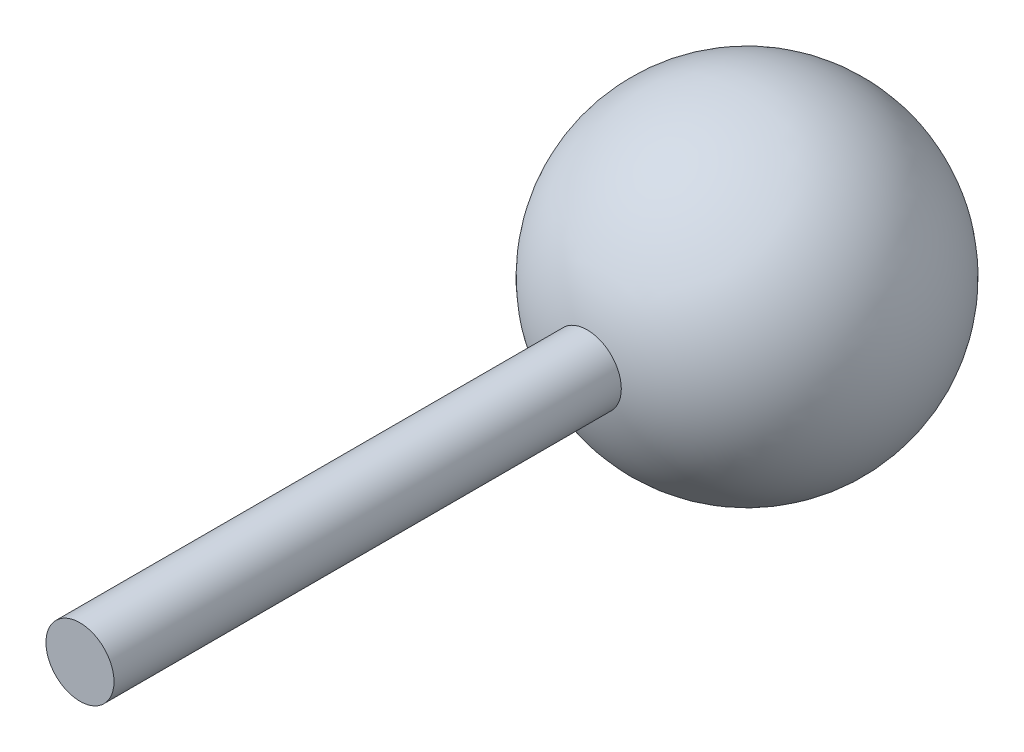
ISO-10303-21;
HEADER;
FILE_DESCRIPTION(('STEP AP214'),'2;1');
FILE_NAME('part.step','',(''),(''),'','','');
FILE_SCHEMA(('AUTOMOTIVE_DESIGN { 1 0 10303 214 1 1 1 1 }'));
ENDSEC;
DATA;
#1=APPLICATION_CONTEXT('core data for automotive mechanical design processes');
#2=APPLICATION_PROTOCOL_DEFINITION('international standard','automotive_design',2000,#1);
#3=PRODUCT_CONTEXT('',#1,'mechanical');
#4=PRODUCT('Part','Part','',(#3));
#5=PRODUCT_RELATED_PRODUCT_CATEGORY('part','',(#4));
#6=PRODUCT_DEFINITION_FORMATION('','',#4);
#7=PRODUCT_DEFINITION_CONTEXT('part definition',#1,'design');
#8=PRODUCT_DEFINITION('design','',#6,#7);
#9=PRODUCT_DEFINITION_SHAPE('','',#8);
#10=(LENGTH_UNIT() NAMED_UNIT(*) SI_UNIT(.MILLI.,.METRE.));
#11=(NAMED_UNIT(*) PLANE_ANGLE_UNIT() SI_UNIT($,.RADIAN.));
#12=(NAMED_UNIT(*) SI_UNIT($,.STERADIAN.) SOLID_ANGLE_UNIT());
#13=UNCERTAINTY_MEASURE_WITH_UNIT(LENGTH_MEASURE(1.E-05),#10,'distance_accuracy_value','');
#14=(GEOMETRIC_REPRESENTATION_CONTEXT(3) GLOBAL_UNCERTAINTY_ASSIGNED_CONTEXT((#13)) GLOBAL_UNIT_ASSIGNED_CONTEXT((#10,
#11,#12)) REPRESENTATION_CONTEXT('',''));
#15=CARTESIAN_POINT('',(0.,0.,0.));
#16=DIRECTION('',(0.,0.,1.));
#17=DIRECTION('',(1.,0.,0.));
#18=AXIS2_PLACEMENT_3D('',#15,#16,#17);
#19=CARTESIAN_POINT('',(0.,-25.,10.3722217202689));
#20=DIRECTION('',(0.,0.,1.));
#21=DIRECTION('',(1.,0.,0.));
#22=AXIS2_PLACEMENT_3D('',#19,#20,#21);
#23=CYLINDRICAL_SURFACE('',#22,2.5);
#24=CARTESIAN_POINT('',(0.,-25.,51.3722217202689));
#25=DIRECTION('',(0.,0.,1.));
#26=DIRECTION('',(1.,0.,0.));
#27=AXIS2_PLACEMENT_3D('',#24,#25,#26);
#28=CIRCLE('',#27,2.5);
#29=CARTESIAN_POINT('',(2.5,-25.,51.3722217202689));
#30=VERTEX_POINT('',#29);
#31=EDGE_CURVE('E41',#30,#30,#28,.T.);
#32=ORIENTED_EDGE('',*,*,#31,.F.);
#33=EDGE_LOOP('',(#32));
#34=FACE_BOUND('',#33,.T.);
#35=CARTESIAN_POINT('',(0.,-25.,14.1089163145744));
#36=DIRECTION('',(0.,0.,-1.));
#37=DIRECTION('',(-1.,0.,0.));
#38=AXIS2_PLACEMENT_3D('',#35,#36,#37);
#39=CIRCLE('',#38,2.5);
#40=CARTESIAN_POINT('',(-2.5,-25.,14.1089163145744));
#41=VERTEX_POINT('',#40);
#42=EDGE_CURVE('E10',#41,#41,#39,.T.);
#43=ORIENTED_EDGE('',*,*,#42,.F.);
#44=EDGE_LOOP('',(#43));
#45=FACE_BOUND('',#44,.T.);
#46=ADVANCED_FACE('F34',(#34,#45),#23,.T.);
#47=CARTESIAN_POINT('',(0.,-25.,51.3722217202689));
#48=DIRECTION('',(0.,0.,1.));
#49=DIRECTION('',(1.,0.,0.));
#50=AXIS2_PLACEMENT_3D('',#47,#48,#49);
#51=PLANE('',#50);
#52=ORIENTED_EDGE('',*,*,#31,.T.);
#53=EDGE_LOOP('',(#52));
#54=FACE_BOUND('',#53,.T.);
#55=ADVANCED_FACE('F47',(#54),#51,.T.);
#56=CARTESIAN_POINT('',(0.,-25.,2.3722217202689));
#57=DIRECTION('',(0.,0.,1.));
#58=DIRECTION('',(-1.,0.,0.));
#59=AXIS2_PLACEMENT_3D('',#56,#57,#58);
#60=SPHERICAL_SURFACE('',#59,12.);
#61=ORIENTED_EDGE('',*,*,#42,.T.);
#62=EDGE_LOOP('',(#61));
#63=FACE_BOUND('',#62,.T.);
#64=ADVANCED_FACE('F36',(#63),#60,.T.);
#65=CLOSED_SHELL('',(#46,#55,#64));
#66=MANIFOLD_SOLID_BREP('B2',#65);
#67=ADVANCED_BREP_SHAPE_REPRESENTATION('',(#18,#66),#14);
#68=SHAPE_DEFINITION_REPRESENTATION(#9,#67);
ENDSEC;
END-ISO-10303-21;
